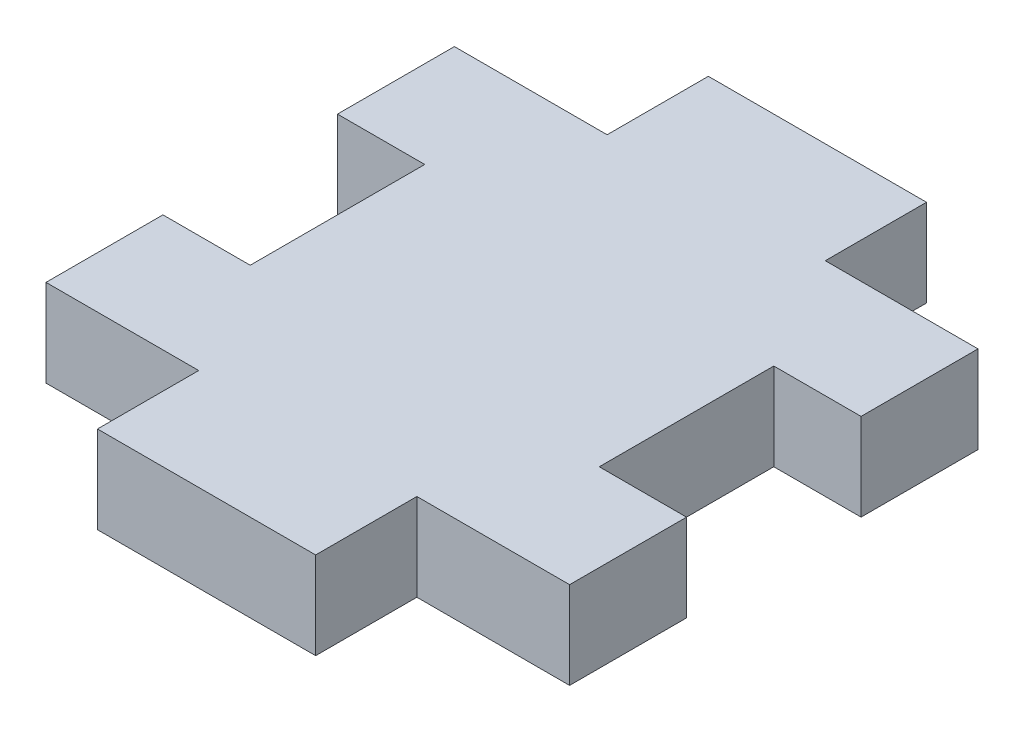
ISO-10303-21;
HEADER;
FILE_DESCRIPTION(('STEP AP214'),'2;1');
FILE_NAME('part.step','',(''),(''),'','','');
FILE_SCHEMA(('AUTOMOTIVE_DESIGN { 1 0 10303 214 1 1 1 1 }'));
ENDSEC;
DATA;
#1=APPLICATION_CONTEXT('core data for automotive mechanical design processes');
#2=APPLICATION_PROTOCOL_DEFINITION('international standard','automotive_design',2000,#1);
#3=PRODUCT_CONTEXT('',#1,'mechanical');
#4=PRODUCT('Part','Part','',(#3));
#5=PRODUCT_RELATED_PRODUCT_CATEGORY('part','',(#4));
#6=PRODUCT_DEFINITION_FORMATION('','',#4);
#7=PRODUCT_DEFINITION_CONTEXT('part definition',#1,'design');
#8=PRODUCT_DEFINITION('design','',#6,#7);
#9=PRODUCT_DEFINITION_SHAPE('','',#8);
#10=(LENGTH_UNIT() NAMED_UNIT(*) SI_UNIT(.MILLI.,.METRE.));
#11=(NAMED_UNIT(*) PLANE_ANGLE_UNIT() SI_UNIT($,.RADIAN.));
#12=(NAMED_UNIT(*) SI_UNIT($,.STERADIAN.) SOLID_ANGLE_UNIT());
#13=UNCERTAINTY_MEASURE_WITH_UNIT(LENGTH_MEASURE(1.E-05),#10,'distance_accuracy_value','');
#14=(GEOMETRIC_REPRESENTATION_CONTEXT(3) GLOBAL_UNCERTAINTY_ASSIGNED_CONTEXT((#13)) GLOBAL_UNIT_ASSIGNED_CONTEXT((#10,
#11,#12)) REPRESENTATION_CONTEXT('',''));
#15=CARTESIAN_POINT('',(0.,0.,0.));
#16=DIRECTION('',(0.,0.,1.));
#17=DIRECTION('',(1.,0.,0.));
#18=AXIS2_PLACEMENT_3D('',#15,#16,#17);
#19=CARTESIAN_POINT('',(-15.875,12.7,-29.718));
#20=DIRECTION('',(1.,0.,0.));
#21=DIRECTION('',(0.,0.,-1.));
#22=AXIS2_PLACEMENT_3D('',#19,#20,#21);
#23=PLANE('',#22);
#24=DIRECTION('',(0.,0.,1.));
#25=VECTOR('',#24,1.);
#26=CARTESIAN_POINT('',(-15.875,0.,-29.718));
#27=LINE('',#26,#25);
#28=CARTESIAN_POINT('',(-15.875,0.,-44.45));
#29=VERTEX_POINT('',#28);
#30=CARTESIAN_POINT('',(-15.875,0.,-29.718));
#31=VERTEX_POINT('',#30);
#32=EDGE_CURVE('E200',#29,#31,#27,.T.);
#33=ORIENTED_EDGE('',*,*,#32,.T.);
#34=DIRECTION('',(0.,-1.,0.));
#35=VECTOR('',#34,1.);
#36=CARTESIAN_POINT('',(-15.875,12.7,-29.718));
#37=LINE('',#36,#35);
#38=CARTESIAN_POINT('',(-15.875,12.7,-29.718));
#39=VERTEX_POINT('',#38);
#40=EDGE_CURVE('E11',#39,#31,#37,.T.);
#41=ORIENTED_EDGE('',*,*,#40,.F.);
#42=DIRECTION('',(0.,0.,1.));
#43=VECTOR('',#42,1.);
#44=CARTESIAN_POINT('',(-15.875,12.7,-29.718));
#45=LINE('',#44,#43);
#46=CARTESIAN_POINT('',(-15.875,12.7,-44.45));
#47=VERTEX_POINT('',#46);
#48=EDGE_CURVE('E238',#47,#39,#45,.T.);
#49=ORIENTED_EDGE('',*,*,#48,.F.);
#50=DIRECTION('',(0.,-1.,0.));
#51=VECTOR('',#50,1.);
#52=CARTESIAN_POINT('',(-15.875,12.7,-44.45));
#53=LINE('',#52,#51);
#54=EDGE_CURVE('E196',#47,#29,#53,.T.);
#55=ORIENTED_EDGE('',*,*,#54,.T.);
#56=EDGE_LOOP('',(#33,#41,#49,#55));
#57=FACE_BOUND('',#56,.T.);
#58=ADVANCED_FACE('F32',(#57),#23,.F.);
#59=CARTESIAN_POINT('',(-15.875,12.7,-29.718));
#60=DIRECTION('',(0.,0.,1.));
#61=DIRECTION('',(1.,0.,0.));
#62=AXIS2_PLACEMENT_3D('',#59,#60,#61);
#63=PLANE('',#62);
#64=DIRECTION('',(-1.,0.,0.));
#65=VECTOR('',#64,1.);
#66=CARTESIAN_POINT('',(-15.875,0.,-29.718));
#67=LINE('',#66,#65);
#68=CARTESIAN_POINT('',(-38.1,0.,-29.718));
#69=VERTEX_POINT('',#68);
#70=EDGE_CURVE('E203',#31,#69,#67,.T.);
#71=ORIENTED_EDGE('',*,*,#70,.T.);
#72=DIRECTION('',(0.,-1.,0.));
#73=VECTOR('',#72,1.);
#74=CARTESIAN_POINT('',(-38.1,12.7,-29.718));
#75=LINE('',#74,#73);
#76=CARTESIAN_POINT('',(-38.1,12.7,-29.718));
#77=VERTEX_POINT('',#76);
#78=EDGE_CURVE('E40',#77,#69,#75,.T.);
#79=ORIENTED_EDGE('',*,*,#78,.F.);
#80=DIRECTION('',(-1.,0.,0.));
#81=VECTOR('',#80,1.);
#82=CARTESIAN_POINT('',(-15.875,12.7,-29.718));
#83=LINE('',#82,#81);
#84=EDGE_CURVE('E127',#39,#77,#83,.T.);
#85=ORIENTED_EDGE('',*,*,#84,.F.);
#86=ORIENTED_EDGE('',*,*,#40,.T.);
#87=EDGE_LOOP('',(#71,#79,#85,#86));
#88=FACE_BOUND('',#87,.T.);
#89=ADVANCED_FACE('F356',(#88),#63,.F.);
#90=CARTESIAN_POINT('',(-38.1,12.7,-12.7));
#91=DIRECTION('',(1.,0.,0.));
#92=DIRECTION('',(0.,0.,-1.));
#93=AXIS2_PLACEMENT_3D('',#90,#91,#92);
#94=PLANE('',#93);
#95=DIRECTION('',(0.,0.,1.));
#96=VECTOR('',#95,1.);
#97=CARTESIAN_POINT('',(-38.1,0.,-12.7));
#98=LINE('',#97,#96);
#99=CARTESIAN_POINT('',(-38.1,0.,-12.7));
#100=VERTEX_POINT('',#99);
#101=EDGE_CURVE('E205',#69,#100,#98,.T.);
#102=ORIENTED_EDGE('',*,*,#101,.T.);
#103=DIRECTION('',(0.,-1.,0.));
#104=VECTOR('',#103,1.);
#105=CARTESIAN_POINT('',(-38.1,12.7,-12.7));
#106=LINE('',#105,#104);
#107=CARTESIAN_POINT('',(-38.1,12.7,-12.7));
#108=VERTEX_POINT('',#107);
#109=EDGE_CURVE('E281',#108,#100,#106,.T.);
#110=ORIENTED_EDGE('',*,*,#109,.F.);
#111=DIRECTION('',(0.,0.,1.));
#112=VECTOR('',#111,1.);
#113=CARTESIAN_POINT('',(-38.1,12.7,-12.7));
#114=LINE('',#113,#112);
#115=EDGE_CURVE('E289',#77,#108,#114,.T.);
#116=ORIENTED_EDGE('',*,*,#115,.F.);
#117=ORIENTED_EDGE('',*,*,#78,.T.);
#118=EDGE_LOOP('',(#102,#110,#116,#117));
#119=FACE_BOUND('',#118,.T.);
#120=ADVANCED_FACE('F287',(#119),#94,.F.);
#121=CARTESIAN_POINT('',(-25.4,12.7,-12.7));
#122=DIRECTION('',(0.,0.,-1.));
#123=DIRECTION('',(-1.,0.,0.));
#124=AXIS2_PLACEMENT_3D('',#121,#122,#123);
#125=PLANE('',#124);
#126=DIRECTION('',(1.,0.,0.));
#127=VECTOR('',#126,1.);
#128=CARTESIAN_POINT('',(-25.4,0.,-12.7));
#129=LINE('',#128,#127);
#130=CARTESIAN_POINT('',(-25.4,0.,-12.7));
#131=VERTEX_POINT('',#130);
#132=EDGE_CURVE('E207',#100,#131,#129,.T.);
#133=ORIENTED_EDGE('',*,*,#132,.T.);
#134=DIRECTION('',(0.,-1.,0.));
#135=VECTOR('',#134,1.);
#136=CARTESIAN_POINT('',(-25.4,12.7,-12.7));
#137=LINE('',#136,#135);
#138=CARTESIAN_POINT('',(-25.4,12.7,-12.7));
#139=VERTEX_POINT('',#138);
#140=EDGE_CURVE('E278',#139,#131,#137,.T.);
#141=ORIENTED_EDGE('',*,*,#140,.F.);
#142=DIRECTION('',(1.,0.,0.));
#143=VECTOR('',#142,1.);
#144=CARTESIAN_POINT('',(-25.4,12.7,-12.7));
#145=LINE('',#144,#143);
#146=EDGE_CURVE('E307',#108,#139,#145,.T.);
#147=ORIENTED_EDGE('',*,*,#146,.F.);
#148=ORIENTED_EDGE('',*,*,#109,.T.);
#149=EDGE_LOOP('',(#133,#141,#147,#148));
#150=FACE_BOUND('',#149,.T.);
#151=ADVANCED_FACE('F298',(#150),#125,.F.);
#152=CARTESIAN_POINT('',(-25.4,12.7,12.7));
#153=DIRECTION('',(1.,0.,0.));
#154=DIRECTION('',(0.,0.,-1.));
#155=AXIS2_PLACEMENT_3D('',#152,#153,#154);
#156=PLANE('',#155);
#157=DIRECTION('',(0.,0.,1.));
#158=VECTOR('',#157,1.);
#159=CARTESIAN_POINT('',(-25.4,0.,12.7));
#160=LINE('',#159,#158);
#161=CARTESIAN_POINT('',(-25.4,0.,12.7));
#162=VERTEX_POINT('',#161);
#163=EDGE_CURVE('E209',#131,#162,#160,.T.);
#164=ORIENTED_EDGE('',*,*,#163,.T.);
#165=DIRECTION('',(0.,-1.,0.));
#166=VECTOR('',#165,1.);
#167=CARTESIAN_POINT('',(-25.4,12.7,12.7));
#168=LINE('',#167,#166);
#169=CARTESIAN_POINT('',(-25.4,12.7,12.7));
#170=VERTEX_POINT('',#169);
#171=EDGE_CURVE('E275',#170,#162,#168,.T.);
#172=ORIENTED_EDGE('',*,*,#171,.F.);
#173=DIRECTION('',(0.,0.,1.));
#174=VECTOR('',#173,1.);
#175=CARTESIAN_POINT('',(-25.4,12.7,12.7));
#176=LINE('',#175,#174);
#177=EDGE_CURVE('E304',#139,#170,#176,.T.);
#178=ORIENTED_EDGE('',*,*,#177,.F.);
#179=ORIENTED_EDGE('',*,*,#140,.T.);
#180=EDGE_LOOP('',(#164,#172,#178,#179));
#181=FACE_BOUND('',#180,.T.);
#182=ADVANCED_FACE('F302',(#181),#156,.F.);
#183=CARTESIAN_POINT('',(-38.1,12.7,12.7));
#184=DIRECTION('',(0.,0.,1.));
#185=DIRECTION('',(1.,0.,0.));
#186=AXIS2_PLACEMENT_3D('',#183,#184,#185);
#187=PLANE('',#186);
#188=DIRECTION('',(-1.,0.,0.));
#189=VECTOR('',#188,1.);
#190=CARTESIAN_POINT('',(-38.1,0.,12.7));
#191=LINE('',#190,#189);
#192=CARTESIAN_POINT('',(-38.1,0.,12.7));
#193=VERTEX_POINT('',#192);
#194=EDGE_CURVE('E211',#162,#193,#191,.T.);
#195=ORIENTED_EDGE('',*,*,#194,.T.);
#196=DIRECTION('',(0.,-1.,0.));
#197=VECTOR('',#196,1.);
#198=CARTESIAN_POINT('',(-38.1,12.7,12.7));
#199=LINE('',#198,#197);
#200=CARTESIAN_POINT('',(-38.1,12.7,12.7));
#201=VERTEX_POINT('',#200);
#202=EDGE_CURVE('E272',#201,#193,#199,.T.);
#203=ORIENTED_EDGE('',*,*,#202,.F.);
#204=DIRECTION('',(-1.,0.,0.));
#205=VECTOR('',#204,1.);
#206=CARTESIAN_POINT('',(-38.1,12.7,12.7));
#207=LINE('',#206,#205);
#208=EDGE_CURVE('E306',#170,#201,#207,.T.);
#209=ORIENTED_EDGE('',*,*,#208,.F.);
#210=ORIENTED_EDGE('',*,*,#171,.T.);
#211=EDGE_LOOP('',(#195,#203,#209,#210));
#212=FACE_BOUND('',#211,.T.);
#213=ADVANCED_FACE('F369',(#212),#187,.F.);
#214=CARTESIAN_POINT('',(-38.1,12.7,29.718));
#215=DIRECTION('',(1.,0.,0.));
#216=DIRECTION('',(0.,0.,-1.));
#217=AXIS2_PLACEMENT_3D('',#214,#215,#216);
#218=PLANE('',#217);
#219=DIRECTION('',(0.,0.,1.));
#220=VECTOR('',#219,1.);
#221=CARTESIAN_POINT('',(-38.1,0.,29.718));
#222=LINE('',#221,#220);
#223=CARTESIAN_POINT('',(-38.1,0.,29.718));
#224=VERTEX_POINT('',#223);
#225=EDGE_CURVE('E213',#193,#224,#222,.T.);
#226=ORIENTED_EDGE('',*,*,#225,.T.);
#227=DIRECTION('',(0.,-1.,0.));
#228=VECTOR('',#227,1.);
#229=CARTESIAN_POINT('',(-38.1,12.7,29.718));
#230=LINE('',#229,#228);
#231=CARTESIAN_POINT('',(-38.1,12.7,29.718));
#232=VERTEX_POINT('',#231);
#233=EDGE_CURVE('E269',#232,#224,#230,.T.);
#234=ORIENTED_EDGE('',*,*,#233,.F.);
#235=DIRECTION('',(0.,0.,1.));
#236=VECTOR('',#235,1.);
#237=CARTESIAN_POINT('',(-38.1,12.7,29.718));
#238=LINE('',#237,#236);
#239=EDGE_CURVE('E309',#201,#232,#238,.T.);
#240=ORIENTED_EDGE('',*,*,#239,.F.);
#241=ORIENTED_EDGE('',*,*,#202,.T.);
#242=EDGE_LOOP('',(#226,#234,#240,#241));
#243=FACE_BOUND('',#242,.T.);
#244=ADVANCED_FACE('F372',(#243),#218,.F.);
#245=CARTESIAN_POINT('',(-15.875,12.7,29.718));
#246=DIRECTION('',(0.,0.,-1.));
#247=DIRECTION('',(-1.,0.,0.));
#248=AXIS2_PLACEMENT_3D('',#245,#246,#247);
#249=PLANE('',#248);
#250=DIRECTION('',(1.,0.,0.));
#251=VECTOR('',#250,1.);
#252=CARTESIAN_POINT('',(-15.875,0.,29.718));
#253=LINE('',#252,#251);
#254=CARTESIAN_POINT('',(-15.875,0.,29.718));
#255=VERTEX_POINT('',#254);
#256=EDGE_CURVE('E215',#224,#255,#253,.T.);
#257=ORIENTED_EDGE('',*,*,#256,.T.);
#258=DIRECTION('',(0.,-1.,0.));
#259=VECTOR('',#258,1.);
#260=CARTESIAN_POINT('',(-15.875,12.7,29.718));
#261=LINE('',#260,#259);
#262=CARTESIAN_POINT('',(-15.875,12.7,29.718));
#263=VERTEX_POINT('',#262);
#264=EDGE_CURVE('E266',#263,#255,#261,.T.);
#265=ORIENTED_EDGE('',*,*,#264,.F.);
#266=DIRECTION('',(1.,0.,0.));
#267=VECTOR('',#266,1.);
#268=CARTESIAN_POINT('',(-15.875,12.7,29.718));
#269=LINE('',#268,#267);
#270=EDGE_CURVE('E315',#232,#263,#269,.T.);
#271=ORIENTED_EDGE('',*,*,#270,.F.);
#272=ORIENTED_EDGE('',*,*,#233,.T.);
#273=EDGE_LOOP('',(#257,#265,#271,#272));
#274=FACE_BOUND('',#273,.T.);
#275=ADVANCED_FACE('F376',(#274),#249,.F.);
#276=CARTESIAN_POINT('',(-15.875,12.7,44.45));
#277=DIRECTION('',(1.,0.,0.));
#278=DIRECTION('',(0.,0.,-1.));
#279=AXIS2_PLACEMENT_3D('',#276,#277,#278);
#280=PLANE('',#279);
#281=DIRECTION('',(0.,0.,1.));
#282=VECTOR('',#281,1.);
#283=CARTESIAN_POINT('',(-15.875,0.,44.45));
#284=LINE('',#283,#282);
#285=CARTESIAN_POINT('',(-15.875,0.,44.45));
#286=VERTEX_POINT('',#285);
#287=EDGE_CURVE('E217',#255,#286,#284,.T.);
#288=ORIENTED_EDGE('',*,*,#287,.T.);
#289=DIRECTION('',(0.,-1.,0.));
#290=VECTOR('',#289,1.);
#291=CARTESIAN_POINT('',(-15.875,12.7,44.45));
#292=LINE('',#291,#290);
#293=CARTESIAN_POINT('',(-15.875,12.7,44.45));
#294=VERTEX_POINT('',#293);
#295=EDGE_CURVE('E263',#294,#286,#292,.T.);
#296=ORIENTED_EDGE('',*,*,#295,.F.);
#297=DIRECTION('',(0.,0.,1.));
#298=VECTOR('',#297,1.);
#299=CARTESIAN_POINT('',(-15.875,12.7,44.45));
#300=LINE('',#299,#298);
#301=EDGE_CURVE('E317',#263,#294,#300,.T.);
#302=ORIENTED_EDGE('',*,*,#301,.F.);
#303=ORIENTED_EDGE('',*,*,#264,.T.);
#304=EDGE_LOOP('',(#288,#296,#302,#303));
#305=FACE_BOUND('',#304,.T.);
#306=ADVANCED_FACE('F380',(#305),#280,.F.);
#307=CARTESIAN_POINT('',(15.875,12.7,44.45));
#308=DIRECTION('',(0.,0.,-1.));
#309=DIRECTION('',(-1.,0.,0.));
#310=AXIS2_PLACEMENT_3D('',#307,#308,#309);
#311=PLANE('',#310);
#312=DIRECTION('',(1.,0.,0.));
#313=VECTOR('',#312,1.);
#314=CARTESIAN_POINT('',(15.875,0.,44.45));
#315=LINE('',#314,#313);
#316=CARTESIAN_POINT('',(15.875,0.,44.45));
#317=VERTEX_POINT('',#316);
#318=EDGE_CURVE('E219',#286,#317,#315,.T.);
#319=ORIENTED_EDGE('',*,*,#318,.T.);
#320=DIRECTION('',(0.,-1.,0.));
#321=VECTOR('',#320,1.);
#322=CARTESIAN_POINT('',(15.875,12.7,44.45));
#323=LINE('',#322,#321);
#324=CARTESIAN_POINT('',(15.875,12.7,44.45));
#325=VERTEX_POINT('',#324);
#326=EDGE_CURVE('E260',#325,#317,#323,.T.);
#327=ORIENTED_EDGE('',*,*,#326,.F.);
#328=DIRECTION('',(1.,0.,0.));
#329=VECTOR('',#328,1.);
#330=CARTESIAN_POINT('',(15.875,12.7,44.45));
#331=LINE('',#330,#329);
#332=EDGE_CURVE('E319',#294,#325,#331,.T.);
#333=ORIENTED_EDGE('',*,*,#332,.F.);
#334=ORIENTED_EDGE('',*,*,#295,.T.);
#335=EDGE_LOOP('',(#319,#327,#333,#334));
#336=FACE_BOUND('',#335,.T.);
#337=ADVANCED_FACE('F384',(#336),#311,.F.);
#338=CARTESIAN_POINT('',(15.875,12.7,44.45));
#339=DIRECTION('',(-1.,0.,0.));
#340=DIRECTION('',(0.,0.,1.));
#341=AXIS2_PLACEMENT_3D('',#338,#339,#340);
#342=PLANE('',#341);
#343=DIRECTION('',(0.,0.,-1.));
#344=VECTOR('',#343,1.);
#345=CARTESIAN_POINT('',(15.875,0.,44.45));
#346=LINE('',#345,#344);
#347=CARTESIAN_POINT('',(15.875,0.,29.718));
#348=VERTEX_POINT('',#347);
#349=EDGE_CURVE('E221',#317,#348,#346,.T.);
#350=ORIENTED_EDGE('',*,*,#349,.T.);
#351=DIRECTION('',(0.,-1.,0.));
#352=VECTOR('',#351,1.);
#353=CARTESIAN_POINT('',(15.875,12.7,29.718));
#354=LINE('',#353,#352);
#355=CARTESIAN_POINT('',(15.875,12.7,29.718));
#356=VERTEX_POINT('',#355);
#357=EDGE_CURVE('E257',#356,#348,#354,.T.);
#358=ORIENTED_EDGE('',*,*,#357,.F.);
#359=DIRECTION('',(0.,0.,-1.));
#360=VECTOR('',#359,1.);
#361=CARTESIAN_POINT('',(15.875,12.7,44.45));
#362=LINE('',#361,#360);
#363=EDGE_CURVE('E321',#325,#356,#362,.T.);
#364=ORIENTED_EDGE('',*,*,#363,.F.);
#365=ORIENTED_EDGE('',*,*,#326,.T.);
#366=EDGE_LOOP('',(#350,#358,#364,#365));
#367=FACE_BOUND('',#366,.T.);
#368=ADVANCED_FACE('F388',(#367),#342,.F.);
#369=CARTESIAN_POINT('',(38.1,12.7,29.718));
#370=DIRECTION('',(0.,0.,-1.));
#371=DIRECTION('',(-1.,0.,0.));
#372=AXIS2_PLACEMENT_3D('',#369,#370,#371);
#373=PLANE('',#372);
#374=DIRECTION('',(1.,0.,0.));
#375=VECTOR('',#374,1.);
#376=CARTESIAN_POINT('',(38.1,0.,29.718));
#377=LINE('',#376,#375);
#378=CARTESIAN_POINT('',(38.1,0.,29.718));
#379=VERTEX_POINT('',#378);
#380=EDGE_CURVE('E223',#348,#379,#377,.T.);
#381=ORIENTED_EDGE('',*,*,#380,.T.);
#382=DIRECTION('',(0.,-1.,0.));
#383=VECTOR('',#382,1.);
#384=CARTESIAN_POINT('',(38.1,12.7,29.718));
#385=LINE('',#384,#383);
#386=CARTESIAN_POINT('',(38.1,12.7,29.718));
#387=VERTEX_POINT('',#386);
#388=EDGE_CURVE('E254',#387,#379,#385,.T.);
#389=ORIENTED_EDGE('',*,*,#388,.F.);
#390=DIRECTION('',(1.,0.,0.));
#391=VECTOR('',#390,1.);
#392=CARTESIAN_POINT('',(38.1,12.7,29.718));
#393=LINE('',#392,#391);
#394=EDGE_CURVE('E323',#356,#387,#393,.T.);
#395=ORIENTED_EDGE('',*,*,#394,.F.);
#396=ORIENTED_EDGE('',*,*,#357,.T.);
#397=EDGE_LOOP('',(#381,#389,#395,#396));
#398=FACE_BOUND('',#397,.T.);
#399=ADVANCED_FACE('F392',(#398),#373,.F.);
#400=CARTESIAN_POINT('',(38.1,12.7,29.718));
#401=DIRECTION('',(-1.,0.,0.));
#402=DIRECTION('',(0.,0.,1.));
#403=AXIS2_PLACEMENT_3D('',#400,#401,#402);
#404=PLANE('',#403);
#405=DIRECTION('',(0.,0.,-1.));
#406=VECTOR('',#405,1.);
#407=CARTESIAN_POINT('',(38.1,0.,29.718));
#408=LINE('',#407,#406);
#409=CARTESIAN_POINT('',(38.1,0.,12.7));
#410=VERTEX_POINT('',#409);
#411=EDGE_CURVE('E225',#379,#410,#408,.T.);
#412=ORIENTED_EDGE('',*,*,#411,.T.);
#413=DIRECTION('',(0.,-1.,0.));
#414=VECTOR('',#413,1.);
#415=CARTESIAN_POINT('',(38.1,12.7,12.7));
#416=LINE('',#415,#414);
#417=CARTESIAN_POINT('',(38.1,12.7,12.7));
#418=VERTEX_POINT('',#417);
#419=EDGE_CURVE('E251',#418,#410,#416,.T.);
#420=ORIENTED_EDGE('',*,*,#419,.F.);
#421=DIRECTION('',(0.,0.,-1.));
#422=VECTOR('',#421,1.);
#423=CARTESIAN_POINT('',(38.1,12.7,29.718));
#424=LINE('',#423,#422);
#425=EDGE_CURVE('E325',#387,#418,#424,.T.);
#426=ORIENTED_EDGE('',*,*,#425,.F.);
#427=ORIENTED_EDGE('',*,*,#388,.T.);
#428=EDGE_LOOP('',(#412,#420,#426,#427));
#429=FACE_BOUND('',#428,.T.);
#430=ADVANCED_FACE('F396',(#429),#404,.F.);
#431=CARTESIAN_POINT('',(38.1,12.7,12.7));
#432=DIRECTION('',(0.,0.,1.));
#433=DIRECTION('',(1.,0.,0.));
#434=AXIS2_PLACEMENT_3D('',#431,#432,#433);
#435=PLANE('',#434);
#436=DIRECTION('',(-1.,0.,0.));
#437=VECTOR('',#436,1.);
#438=CARTESIAN_POINT('',(38.1,0.,12.7));
#439=LINE('',#438,#437);
#440=CARTESIAN_POINT('',(25.4,0.,12.7));
#441=VERTEX_POINT('',#440);
#442=EDGE_CURVE('E227',#410,#441,#439,.T.);
#443=ORIENTED_EDGE('',*,*,#442,.T.);
#444=DIRECTION('',(0.,-1.,0.));
#445=VECTOR('',#444,1.);
#446=CARTESIAN_POINT('',(25.4,12.7,12.7));
#447=LINE('',#446,#445);
#448=CARTESIAN_POINT('',(25.4,12.7,12.7));
#449=VERTEX_POINT('',#448);
#450=EDGE_CURVE('E248',#449,#441,#447,.T.);
#451=ORIENTED_EDGE('',*,*,#450,.F.);
#452=DIRECTION('',(-1.,0.,0.));
#453=VECTOR('',#452,1.);
#454=CARTESIAN_POINT('',(38.1,12.7,12.7));
#455=LINE('',#454,#453);
#456=EDGE_CURVE('E327',#418,#449,#455,.T.);
#457=ORIENTED_EDGE('',*,*,#456,.F.);
#458=ORIENTED_EDGE('',*,*,#419,.T.);
#459=EDGE_LOOP('',(#443,#451,#457,#458));
#460=FACE_BOUND('',#459,.T.);
#461=ADVANCED_FACE('F400',(#460),#435,.F.);
#462=CARTESIAN_POINT('',(25.4,12.7,12.7));
#463=DIRECTION('',(-1.,0.,0.));
#464=DIRECTION('',(0.,0.,1.));
#465=AXIS2_PLACEMENT_3D('',#462,#463,#464);
#466=PLANE('',#465);
#467=DIRECTION('',(0.,0.,-1.));
#468=VECTOR('',#467,1.);
#469=CARTESIAN_POINT('',(25.4,0.,12.7));
#470=LINE('',#469,#468);
#471=CARTESIAN_POINT('',(25.4,0.,-12.7));
#472=VERTEX_POINT('',#471);
#473=EDGE_CURVE('E229',#441,#472,#470,.T.);
#474=ORIENTED_EDGE('',*,*,#473,.T.);
#475=DIRECTION('',(0.,-1.,0.));
#476=VECTOR('',#475,1.);
#477=CARTESIAN_POINT('',(25.4,12.7,-12.7));
#478=LINE('',#477,#476);
#479=CARTESIAN_POINT('',(25.4,12.7,-12.7));
#480=VERTEX_POINT('',#479);
#481=EDGE_CURVE('E245',#480,#472,#478,.T.);
#482=ORIENTED_EDGE('',*,*,#481,.F.);
#483=DIRECTION('',(0.,0.,-1.));
#484=VECTOR('',#483,1.);
#485=CARTESIAN_POINT('',(25.4,12.7,12.7));
#486=LINE('',#485,#484);
#487=EDGE_CURVE('E329',#449,#480,#486,.T.);
#488=ORIENTED_EDGE('',*,*,#487,.F.);
#489=ORIENTED_EDGE('',*,*,#450,.T.);
#490=EDGE_LOOP('',(#474,#482,#488,#489));
#491=FACE_BOUND('',#490,.T.);
#492=ADVANCED_FACE('F404',(#491),#466,.F.);
#493=CARTESIAN_POINT('',(25.4,12.7,-12.7));
#494=DIRECTION('',(0.,0.,-1.));
#495=DIRECTION('',(-1.,0.,0.));
#496=AXIS2_PLACEMENT_3D('',#493,#494,#495);
#497=PLANE('',#496);
#498=DIRECTION('',(1.,0.,0.));
#499=VECTOR('',#498,1.);
#500=CARTESIAN_POINT('',(25.4,0.,-12.7));
#501=LINE('',#500,#499);
#502=CARTESIAN_POINT('',(38.1,0.,-12.7));
#503=VERTEX_POINT('',#502);
#504=EDGE_CURVE('E231',#472,#503,#501,.T.);
#505=ORIENTED_EDGE('',*,*,#504,.T.);
#506=DIRECTION('',(0.,-1.,0.));
#507=VECTOR('',#506,1.);
#508=CARTESIAN_POINT('',(38.1,12.7,-12.7));
#509=LINE('',#508,#507);
#510=CARTESIAN_POINT('',(38.1,12.7,-12.7));
#511=VERTEX_POINT('',#510);
#512=EDGE_CURVE('E242',#511,#503,#509,.T.);
#513=ORIENTED_EDGE('',*,*,#512,.F.);
#514=DIRECTION('',(1.,0.,0.));
#515=VECTOR('',#514,1.);
#516=CARTESIAN_POINT('',(25.4,12.7,-12.7));
#517=LINE('',#516,#515);
#518=EDGE_CURVE('E331',#480,#511,#517,.T.);
#519=ORIENTED_EDGE('',*,*,#518,.F.);
#520=ORIENTED_EDGE('',*,*,#481,.T.);
#521=EDGE_LOOP('',(#505,#513,#519,#520));
#522=FACE_BOUND('',#521,.T.);
#523=ADVANCED_FACE('F337',(#522),#497,.F.);
#524=CARTESIAN_POINT('',(38.1,12.7,-12.7));
#525=DIRECTION('',(-1.,0.,0.));
#526=DIRECTION('',(0.,0.,1.));
#527=AXIS2_PLACEMENT_3D('',#524,#525,#526);
#528=PLANE('',#527);
#529=DIRECTION('',(0.,0.,-1.));
#530=VECTOR('',#529,1.);
#531=CARTESIAN_POINT('',(38.1,0.,-12.7));
#532=LINE('',#531,#530);
#533=CARTESIAN_POINT('',(38.1,0.,-29.718));
#534=VERTEX_POINT('',#533);
#535=EDGE_CURVE('E233',#503,#534,#532,.T.);
#536=ORIENTED_EDGE('',*,*,#535,.T.);
#537=DIRECTION('',(0.,-1.,0.));
#538=VECTOR('',#537,1.);
#539=CARTESIAN_POINT('',(38.1,12.7,-29.718));
#540=LINE('',#539,#538);
#541=CARTESIAN_POINT('',(38.1,12.7,-29.718));
#542=VERTEX_POINT('',#541);
#543=EDGE_CURVE('E191',#542,#534,#540,.T.);
#544=ORIENTED_EDGE('',*,*,#543,.F.);
#545=DIRECTION('',(0.,0.,-1.));
#546=VECTOR('',#545,1.);
#547=CARTESIAN_POINT('',(38.1,12.7,-12.7));
#548=LINE('',#547,#546);
#549=EDGE_CURVE('E182',#511,#542,#548,.T.);
#550=ORIENTED_EDGE('',*,*,#549,.F.);
#551=ORIENTED_EDGE('',*,*,#512,.T.);
#552=EDGE_LOOP('',(#536,#544,#550,#551));
#553=FACE_BOUND('',#552,.T.);
#554=ADVANCED_FACE('F341',(#553),#528,.F.);
#555=CARTESIAN_POINT('',(38.1,12.7,-29.718));
#556=DIRECTION('',(0.,0.,1.));
#557=DIRECTION('',(1.,0.,0.));
#558=AXIS2_PLACEMENT_3D('',#555,#556,#557);
#559=PLANE('',#558);
#560=DIRECTION('',(-1.,0.,0.));
#561=VECTOR('',#560,1.);
#562=CARTESIAN_POINT('',(38.1,0.,-29.718));
#563=LINE('',#562,#561);
#564=CARTESIAN_POINT('',(15.875,0.,-29.718));
#565=VERTEX_POINT('',#564);
#566=EDGE_CURVE('E190',#534,#565,#563,.T.);
#567=ORIENTED_EDGE('',*,*,#566,.T.);
#568=DIRECTION('',(0.,-1.,0.));
#569=VECTOR('',#568,1.);
#570=CARTESIAN_POINT('',(15.875,12.7,-29.718));
#571=LINE('',#570,#569);
#572=CARTESIAN_POINT('',(15.875,12.7,-29.718));
#573=VERTEX_POINT('',#572);
#574=EDGE_CURVE('E187',#573,#565,#571,.T.);
#575=ORIENTED_EDGE('',*,*,#574,.F.);
#576=DIRECTION('',(-1.,0.,0.));
#577=VECTOR('',#576,1.);
#578=CARTESIAN_POINT('',(38.1,12.7,-29.718));
#579=LINE('',#578,#577);
#580=EDGE_CURVE('E176',#542,#573,#579,.T.);
#581=ORIENTED_EDGE('',*,*,#580,.F.);
#582=ORIENTED_EDGE('',*,*,#543,.T.);
#583=EDGE_LOOP('',(#567,#575,#581,#582));
#584=FACE_BOUND('',#583,.T.);
#585=ADVANCED_FACE('F188',(#584),#559,.F.);
#586=CARTESIAN_POINT('',(15.875,12.7,-29.718));
#587=DIRECTION('',(-1.,0.,0.));
#588=DIRECTION('',(0.,0.,1.));
#589=AXIS2_PLACEMENT_3D('',#586,#587,#588);
#590=PLANE('',#589);
#591=DIRECTION('',(0.,0.,-1.));
#592=VECTOR('',#591,1.);
#593=CARTESIAN_POINT('',(15.875,0.,-29.718));
#594=LINE('',#593,#592);
#595=CARTESIAN_POINT('',(15.875,0.,-44.45));
#596=VERTEX_POINT('',#595);
#597=EDGE_CURVE('E113',#565,#596,#594,.T.);
#598=ORIENTED_EDGE('',*,*,#597,.T.);
#599=DIRECTION('',(0.,-1.,0.));
#600=VECTOR('',#599,1.);
#601=CARTESIAN_POINT('',(15.875,12.7,-44.45));
#602=LINE('',#601,#600);
#603=CARTESIAN_POINT('',(15.875,12.7,-44.45));
#604=VERTEX_POINT('',#603);
#605=EDGE_CURVE('E192',#604,#596,#602,.T.);
#606=ORIENTED_EDGE('',*,*,#605,.F.);
#607=DIRECTION('',(0.,0.,-1.));
#608=VECTOR('',#607,1.);
#609=CARTESIAN_POINT('',(15.875,12.7,-29.718));
#610=LINE('',#609,#608);
#611=EDGE_CURVE('E180',#573,#604,#610,.T.);
#612=ORIENTED_EDGE('',*,*,#611,.F.);
#613=ORIENTED_EDGE('',*,*,#574,.T.);
#614=EDGE_LOOP('',(#598,#606,#612,#613));
#615=FACE_BOUND('',#614,.T.);
#616=ADVANCED_FACE('F194',(#615),#590,.F.);
#617=CARTESIAN_POINT('',(15.875,12.7,-44.45));
#618=DIRECTION('',(0.,0.,1.));
#619=DIRECTION('',(1.,0.,0.));
#620=AXIS2_PLACEMENT_3D('',#617,#618,#619);
#621=PLANE('',#620);
#622=DIRECTION('',(-1.,0.,0.));
#623=VECTOR('',#622,1.);
#624=CARTESIAN_POINT('',(15.875,0.,-44.45));
#625=LINE('',#624,#623);
#626=EDGE_CURVE('E119',#596,#29,#625,.T.);
#627=ORIENTED_EDGE('',*,*,#626,.T.);
#628=ORIENTED_EDGE('',*,*,#54,.F.);
#629=DIRECTION('',(-1.,0.,0.));
#630=VECTOR('',#629,1.);
#631=CARTESIAN_POINT('',(15.875,12.7,-44.45));
#632=LINE('',#631,#630);
#633=EDGE_CURVE('E48',#604,#47,#632,.T.);
#634=ORIENTED_EDGE('',*,*,#633,.F.);
#635=ORIENTED_EDGE('',*,*,#605,.T.);
#636=EDGE_LOOP('',(#627,#628,#634,#635));
#637=FACE_BOUND('',#636,.T.);
#638=ADVANCED_FACE('F345',(#637),#621,.F.);
#639=CARTESIAN_POINT('',(0.,12.7,0.));
#640=DIRECTION('',(0.,1.,0.));
#641=DIRECTION('',(0.,0.,1.));
#642=AXIS2_PLACEMENT_3D('',#639,#640,#641);
#643=PLANE('',#642);
#644=ORIENTED_EDGE('',*,*,#48,.T.);
#645=ORIENTED_EDGE('',*,*,#84,.T.);
#646=ORIENTED_EDGE('',*,*,#115,.T.);
#647=ORIENTED_EDGE('',*,*,#146,.T.);
#648=ORIENTED_EDGE('',*,*,#177,.T.);
#649=ORIENTED_EDGE('',*,*,#208,.T.);
#650=ORIENTED_EDGE('',*,*,#239,.T.);
#651=ORIENTED_EDGE('',*,*,#270,.T.);
#652=ORIENTED_EDGE('',*,*,#301,.T.);
#653=ORIENTED_EDGE('',*,*,#332,.T.);
#654=ORIENTED_EDGE('',*,*,#363,.T.);
#655=ORIENTED_EDGE('',*,*,#394,.T.);
#656=ORIENTED_EDGE('',*,*,#425,.T.);
#657=ORIENTED_EDGE('',*,*,#456,.T.);
#658=ORIENTED_EDGE('',*,*,#487,.T.);
#659=ORIENTED_EDGE('',*,*,#518,.T.);
#660=ORIENTED_EDGE('',*,*,#549,.T.);
#661=ORIENTED_EDGE('',*,*,#580,.T.);
#662=ORIENTED_EDGE('',*,*,#611,.T.);
#663=ORIENTED_EDGE('',*,*,#633,.T.);
#664=EDGE_LOOP('',(#644,#645,#646,#647,#648,#649,#650,#651,#652,#653,#654,#655,#656,#657,#658,
#659,#660,#661,#662,#663));
#665=FACE_BOUND('',#664,.T.);
#666=ADVANCED_FACE('F178',(#665),#643,.T.);
#667=CARTESIAN_POINT('',(0.,0.,0.));
#668=DIRECTION('',(0.,1.,0.));
#669=DIRECTION('',(0.,0.,1.));
#670=AXIS2_PLACEMENT_3D('',#667,#668,#669);
#671=PLANE('',#670);
#672=ORIENTED_EDGE('',*,*,#32,.F.);
#673=ORIENTED_EDGE('',*,*,#626,.F.);
#674=ORIENTED_EDGE('',*,*,#597,.F.);
#675=ORIENTED_EDGE('',*,*,#566,.F.);
#676=ORIENTED_EDGE('',*,*,#535,.F.);
#677=ORIENTED_EDGE('',*,*,#504,.F.);
#678=ORIENTED_EDGE('',*,*,#473,.F.);
#679=ORIENTED_EDGE('',*,*,#442,.F.);
#680=ORIENTED_EDGE('',*,*,#411,.F.);
#681=ORIENTED_EDGE('',*,*,#380,.F.);
#682=ORIENTED_EDGE('',*,*,#349,.F.);
#683=ORIENTED_EDGE('',*,*,#318,.F.);
#684=ORIENTED_EDGE('',*,*,#287,.F.);
#685=ORIENTED_EDGE('',*,*,#256,.F.);
#686=ORIENTED_EDGE('',*,*,#225,.F.);
#687=ORIENTED_EDGE('',*,*,#194,.F.);
#688=ORIENTED_EDGE('',*,*,#163,.F.);
#689=ORIENTED_EDGE('',*,*,#132,.F.);
#690=ORIENTED_EDGE('',*,*,#101,.F.);
#691=ORIENTED_EDGE('',*,*,#70,.F.);
#692=EDGE_LOOP('',(#672,#673,#674,#675,#676,#677,#678,#679,#680,#681,#682,#683,#684,#685,#686,
#687,#688,#689,#690,#691));
#693=FACE_BOUND('',#692,.T.);
#694=ADVANCED_FACE('F293',(#693),#671,.F.);
#695=CLOSED_SHELL('',(#58,#89,#120,#151,#182,#213,#244,#275,#306,#337,#368,#399,#430,#461,#492,
#523,#554,#585,#616,#638,#666,#694));
#696=MANIFOLD_SOLID_BREP('B2',#695);
#697=ADVANCED_BREP_SHAPE_REPRESENTATION('',(#18,#696),#14);
#698=SHAPE_DEFINITION_REPRESENTATION(#9,#697);
ENDSEC;
END-ISO-10303-21;
